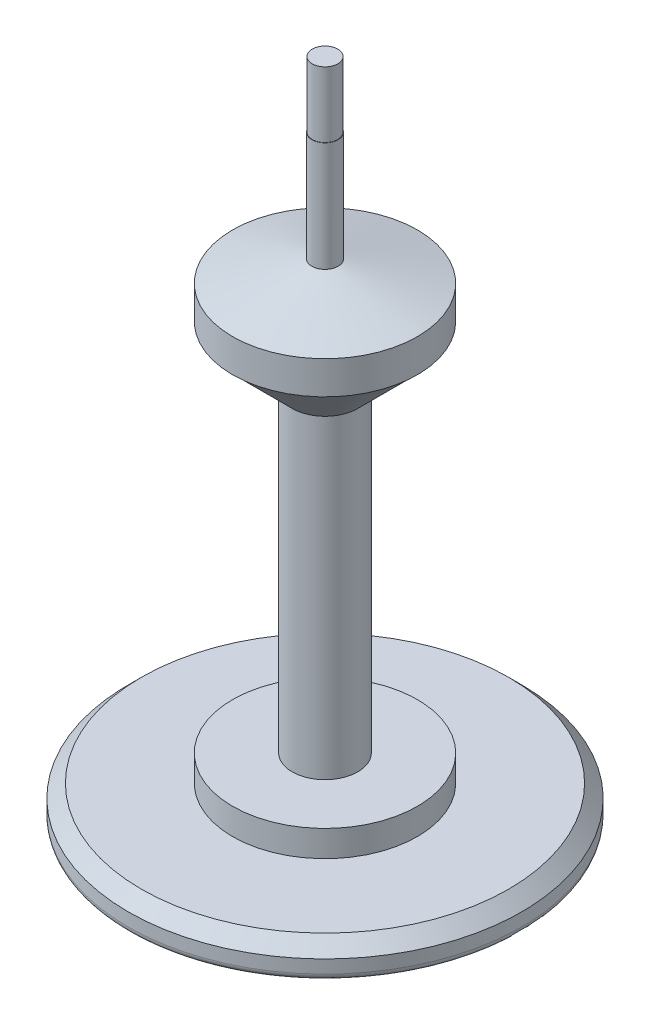
ISO-10303-21;
HEADER;
FILE_DESCRIPTION(('STEP AP214'),'2;1');
FILE_NAME('part.step','',(''),(''),'','','');
FILE_SCHEMA(('AUTOMOTIVE_DESIGN { 1 0 10303 214 1 1 1 1 }'));
ENDSEC;
DATA;
#1=APPLICATION_CONTEXT('core data for automotive mechanical design processes');
#2=APPLICATION_PROTOCOL_DEFINITION('international standard','automotive_design',2000,#1);
#3=PRODUCT_CONTEXT('',#1,'mechanical');
#4=PRODUCT('Part','Part','',(#3));
#5=PRODUCT_RELATED_PRODUCT_CATEGORY('part','',(#4));
#6=PRODUCT_DEFINITION_FORMATION('','',#4);
#7=PRODUCT_DEFINITION_CONTEXT('part definition',#1,'design');
#8=PRODUCT_DEFINITION('design','',#6,#7);
#9=PRODUCT_DEFINITION_SHAPE('','',#8);
#10=(LENGTH_UNIT() NAMED_UNIT(*) SI_UNIT(.MILLI.,.METRE.));
#11=(NAMED_UNIT(*) PLANE_ANGLE_UNIT() SI_UNIT($,.RADIAN.));
#12=(NAMED_UNIT(*) SI_UNIT($,.STERADIAN.) SOLID_ANGLE_UNIT());
#13=UNCERTAINTY_MEASURE_WITH_UNIT(LENGTH_MEASURE(1.E-05),#10,'distance_accuracy_value','');
#14=(GEOMETRIC_REPRESENTATION_CONTEXT(3) GLOBAL_UNCERTAINTY_ASSIGNED_CONTEXT((#13)) GLOBAL_UNIT_ASSIGNED_CONTEXT((#10,
#11,#12)) REPRESENTATION_CONTEXT('',''));
#15=CARTESIAN_POINT('',(0.,0.,0.));
#16=DIRECTION('',(0.,0.,1.));
#17=DIRECTION('',(1.,0.,0.));
#18=AXIS2_PLACEMENT_3D('',#15,#16,#17);
#19=CARTESIAN_POINT('',(0.,79.3548387096774,0.));
#20=DIRECTION('',(0.,1.,0.));
#21=DIRECTION('',(0.,0.,1.));
#22=AXIS2_PLACEMENT_3D('',#19,#20,#21);
#23=CYLINDRICAL_SURFACE('',#22,30.);
#24=CARTESIAN_POINT('',(0.,-52.1048387096774,0.));
#25=DIRECTION('',(0.,-1.,0.));
#26=DIRECTION('',(0.,0.,-1.));
#27=AXIS2_PLACEMENT_3D('',#24,#25,#26);
#28=CIRCLE('',#27,30.);
#29=CARTESIAN_POINT('',(0.,-52.1048387096774,-30.));
#30=VERTEX_POINT('',#29);
#31=EDGE_CURVE('E48',#30,#30,#28,.F.);
#32=ORIENTED_EDGE('',*,*,#31,.T.);
#33=EDGE_LOOP('',(#32));
#34=FACE_BOUND('',#33,.T.);
#35=CARTESIAN_POINT('',(0.,-50.1048387096774,0.));
#36=DIRECTION('',(0.,1.,0.));
#37=DIRECTION('',(0.,0.,1.));
#38=AXIS2_PLACEMENT_3D('',#35,#36,#37);
#39=CIRCLE('',#38,30.);
#40=CARTESIAN_POINT('',(0.,-50.1048387096774,30.));
#41=VERTEX_POINT('',#40);
#42=EDGE_CURVE('E53',#41,#41,#39,.F.);
#43=ORIENTED_EDGE('',*,*,#42,.T.);
#44=EDGE_LOOP('',(#43));
#45=FACE_BOUND('',#44,.T.);
#46=ADVANCED_FACE('F33',(#34,#45),#23,.T.);
#47=CARTESIAN_POINT('',(-30.,-48.1048387096774,0.));
#48=DIRECTION('',(0.,1.,0.));
#49=DIRECTION('',(0.,0.,1.));
#50=AXIS2_PLACEMENT_3D('',#47,#48,#49);
#51=PLANE('',#50);
#52=CARTESIAN_POINT('',(0.,-48.1048387096774,0.));
#53=DIRECTION('',(0.,1.,0.));
#54=DIRECTION('',(0.,0.,1.));
#55=AXIS2_PLACEMENT_3D('',#52,#53,#54);
#56=CIRCLE('',#55,28.);
#57=CARTESIAN_POINT('',(0.,-48.1048387096774,28.));
#58=VERTEX_POINT('',#57);
#59=EDGE_CURVE('E56',#58,#58,#56,.T.);
#60=ORIENTED_EDGE('',*,*,#59,.T.);
#61=EDGE_LOOP('',(#60));
#62=FACE_BOUND('',#61,.T.);
#63=CARTESIAN_POINT('',(0.,-48.1048387096774,0.));
#64=DIRECTION('',(0.,1.,0.));
#65=DIRECTION('',(0.,0.,1.));
#66=AXIS2_PLACEMENT_3D('',#63,#64,#65);
#67=CIRCLE('',#66,14.1);
#68=CARTESIAN_POINT('',(0.,-48.1048387096774,14.1));
#69=VERTEX_POINT('',#68);
#70=EDGE_CURVE('E76',#69,#69,#67,.T.);
#71=ORIENTED_EDGE('',*,*,#70,.F.);
#72=EDGE_LOOP('',(#71));
#73=FACE_BOUND('',#72,.T.);
#74=ADVANCED_FACE('F118',(#62,#73),#51,.T.);
#75=CARTESIAN_POINT('',(0.,79.3548387096774,0.));
#76=DIRECTION('',(0.,1.,0.));
#77=DIRECTION('',(0.,0.,1.));
#78=AXIS2_PLACEMENT_3D('',#75,#76,#77);
#79=CYLINDRICAL_SURFACE('',#78,14.1);
#80=ORIENTED_EDGE('',*,*,#70,.T.);
#81=EDGE_LOOP('',(#80));
#82=FACE_BOUND('',#81,.T.);
#83=CARTESIAN_POINT('',(0.,-44.1048387096774,0.));
#84=DIRECTION('',(0.,1.,0.));
#85=DIRECTION('',(0.,0.,1.));
#86=AXIS2_PLACEMENT_3D('',#83,#84,#85);
#87=CIRCLE('',#86,14.1);
#88=CARTESIAN_POINT('',(0.,-44.1048387096774,14.1));
#89=VERTEX_POINT('',#88);
#90=EDGE_CURVE('E73',#89,#89,#87,.T.);
#91=ORIENTED_EDGE('',*,*,#90,.F.);
#92=EDGE_LOOP('',(#91));
#93=FACE_BOUND('',#92,.T.);
#94=ADVANCED_FACE('F124',(#82,#93),#79,.T.);
#95=CARTESIAN_POINT('',(-14.1,-44.1048387096774,0.));
#96=DIRECTION('',(0.,1.,0.));
#97=DIRECTION('',(0.,0.,1.));
#98=AXIS2_PLACEMENT_3D('',#95,#96,#97);
#99=PLANE('',#98);
#100=ORIENTED_EDGE('',*,*,#90,.T.);
#101=EDGE_LOOP('',(#100));
#102=FACE_BOUND('',#101,.T.);
#103=CARTESIAN_POINT('',(0.,-44.1048387096774,0.));
#104=DIRECTION('',(0.,1.,0.));
#105=DIRECTION('',(0.,0.,1.));
#106=AXIS2_PLACEMENT_3D('',#103,#104,#105);
#107=CIRCLE('',#106,4.99999999999999);
#108=CARTESIAN_POINT('',(0.,-44.1048387096774,4.99999999999999));
#109=VERTEX_POINT('',#108);
#110=EDGE_CURVE('E70',#109,#109,#107,.T.);
#111=ORIENTED_EDGE('',*,*,#110,.F.);
#112=EDGE_LOOP('',(#111));
#113=FACE_BOUND('',#112,.T.);
#114=ADVANCED_FACE('F132',(#102,#113),#99,.T.);
#115=CARTESIAN_POINT('',(0.,79.3548387096774,0.));
#116=DIRECTION('',(0.,1.,0.));
#117=DIRECTION('',(0.,0.,1.));
#118=AXIS2_PLACEMENT_3D('',#115,#116,#117);
#119=CYLINDRICAL_SURFACE('',#118,4.99999999999999);
#120=CARTESIAN_POINT('',(0.,3.89516129032265,0.));
#121=DIRECTION('',(0.,-1.,0.));
#122=DIRECTION('',(0.,0.,-1.));
#123=AXIS2_PLACEMENT_3D('',#120,#121,#122);
#124=CIRCLE('',#123,4.99999999999999);
#125=CARTESIAN_POINT('',(0.,3.89516129032265,-4.99999999999999));
#126=VERTEX_POINT('',#125);
#127=EDGE_CURVE('E10',#126,#126,#124,.T.);
#128=ORIENTED_EDGE('',*,*,#127,.T.);
#129=EDGE_LOOP('',(#128));
#130=FACE_BOUND('',#129,.T.);
#131=ORIENTED_EDGE('',*,*,#110,.T.);
#132=EDGE_LOOP('',(#131));
#133=FACE_BOUND('',#132,.T.);
#134=ADVANCED_FACE('F136',(#130,#133),#119,.T.);
#135=CARTESIAN_POINT('',(-4.99999999999999,12.8951612903226,0.));
#136=DIRECTION('',(0.,-1.,0.));
#137=DIRECTION('',(0.,0.,-1.));
#138=AXIS2_PLACEMENT_3D('',#135,#136,#137);
#139=PLANE('',#138);
#140=CARTESIAN_POINT('',(0.,12.8951612903226,0.));
#141=DIRECTION('',(0.,-1.,0.));
#142=DIRECTION('',(0.,0.,-1.));
#143=AXIS2_PLACEMENT_3D('',#140,#141,#142);
#144=CIRCLE('',#143,14.);
#145=CARTESIAN_POINT('',(0.,12.8951612903226,-14.));
#146=VERTEX_POINT('',#145);
#147=EDGE_CURVE('E40',#146,#146,#144,.F.);
#148=ORIENTED_EDGE('',*,*,#147,.T.);
#149=EDGE_LOOP('',(#148));
#150=FACE_BOUND('',#149,.T.);
#151=CARTESIAN_POINT('',(0.,12.8951612903226,0.));
#152=DIRECTION('',(0.,1.,0.));
#153=DIRECTION('',(0.,0.,1.));
#154=AXIS2_PLACEMENT_3D('',#151,#152,#153);
#155=CIRCLE('',#154,14.1);
#156=CARTESIAN_POINT('',(0.,12.8951612903226,14.1));
#157=VERTEX_POINT('',#156);
#158=EDGE_CURVE('E64',#157,#157,#155,.T.);
#159=ORIENTED_EDGE('',*,*,#158,.F.);
#160=EDGE_LOOP('',(#159));
#161=FACE_BOUND('',#160,.T.);
#162=ADVANCED_FACE('F140',(#150,#161),#139,.T.);
#163=CARTESIAN_POINT('',(0.,79.3548387096774,0.));
#164=DIRECTION('',(0.,1.,0.));
#165=DIRECTION('',(0.,0.,1.));
#166=AXIS2_PLACEMENT_3D('',#163,#164,#165);
#167=CYLINDRICAL_SURFACE('',#166,14.1);
#168=CARTESIAN_POINT('',(0.,17.9353536691873,0.));
#169=DIRECTION('',(0.,-1.,0.));
#170=DIRECTION('',(0.,0.,-1.));
#171=AXIS2_PLACEMENT_3D('',#168,#169,#170);
#172=CIRCLE('',#171,14.1);
#173=CARTESIAN_POINT('',(0.,17.9353536691873,-14.1));
#174=VERTEX_POINT('',#173);
#175=EDGE_CURVE('E63',#174,#174,#172,.F.);
#176=ORIENTED_EDGE('',*,*,#175,.F.);
#177=EDGE_LOOP('',(#176));
#178=FACE_BOUND('',#177,.T.);
#179=ORIENTED_EDGE('',*,*,#158,.T.);
#180=EDGE_LOOP('',(#179));
#181=FACE_BOUND('',#180,.T.);
#182=ADVANCED_FACE('F113',(#178,#181),#167,.T.);
#183=CARTESIAN_POINT('',(-30.,-53.1048387096774,0.));
#184=DIRECTION('',(0.,-1.,0.));
#185=DIRECTION('',(0.,0.,-1.));
#186=AXIS2_PLACEMENT_3D('',#183,#184,#185);
#187=PLANE('',#186);
#188=CARTESIAN_POINT('',(0.,-53.1048387096774,0.));
#189=DIRECTION('',(0.,-1.,0.));
#190=DIRECTION('',(0.,0.,-1.));
#191=AXIS2_PLACEMENT_3D('',#188,#189,#190);
#192=CIRCLE('',#191,29.);
#193=CARTESIAN_POINT('',(0.,-53.1048387096774,-29.));
#194=VERTEX_POINT('',#193);
#195=EDGE_CURVE('E44',#194,#194,#192,.T.);
#196=ORIENTED_EDGE('',*,*,#195,.T.);
#197=EDGE_LOOP('',(#196));
#198=FACE_BOUND('',#197,.T.);
#199=ADVANCED_FACE('F104',(#198),#187,.T.);
#200=CARTESIAN_POINT('',(0.,49.6815158887196,0.));
#201=DIRECTION('',(0.,1.,0.));
#202=DIRECTION('',(0.,0.,1.));
#203=AXIS2_PLACEMENT_3D('',#200,#201,#202);
#204=CYLINDRICAL_SURFACE('',#203,2.);
#205=CARTESIAN_POINT('',(0.,21.1775388976038,0.));
#206=DIRECTION('',(0.,1.,0.));
#207=DIRECTION('',(0.,0.,1.));
#208=AXIS2_PLACEMENT_3D('',#205,#206,#207);
#209=CIRCLE('',#208,2.);
#210=CARTESIAN_POINT('',(0.,21.1775388976038,-1.99999999999996));
#211=VERTEX_POINT('',#210);
#212=EDGE_CURVE('E60',#211,#211,#209,.T.);
#213=ORIENTED_EDGE('',*,*,#212,.T.);
#214=EDGE_LOOP('',(#213));
#215=FACE_BOUND('',#214,.T.);
#216=CARTESIAN_POINT('',(0.,37.8951612903226,0.));
#217=DIRECTION('',(0.,1.,0.));
#218=DIRECTION('',(0.,0.,1.));
#219=AXIS2_PLACEMENT_3D('',#216,#217,#218);
#220=CIRCLE('',#219,1.99999999999998);
#221=CARTESIAN_POINT('',(0.,37.8951612903226,1.99999999999998));
#222=VERTEX_POINT('',#221);
#223=EDGE_CURVE('E65',#222,#222,#220,.T.);
#224=ORIENTED_EDGE('',*,*,#223,.F.);
#225=EDGE_LOOP('',(#224));
#226=FACE_BOUND('',#225,.T.);
#227=ADVANCED_FACE('F102',(#215,#226),#204,.T.);
#228=CARTESIAN_POINT('',(0.,17.8951612903226,0.));
#229=DIRECTION('',(0.,-1.,0.));
#230=DIRECTION('',(0.,0.,-1.));
#231=AXIS2_PLACEMENT_3D('',#228,#229,#230);
#232=CONICAL_SURFACE('',#231,14.25,1.30899693899575);
#233=CARTESIAN_POINT('',(0.,17.9353536691873,-14.1));
#234=CARTESIAN_POINT('',(0.,17.9691264319833,-13.9739583333333));
#235=CARTESIAN_POINT('',(0.,18.0028991947793,-13.8479166666666));
#236=CARTESIAN_POINT('',(0.,18.0704447203713,-13.5958333333333));
#237=CARTESIAN_POINT('',(0.,18.1042174831673,-13.4697916666666));
#238=CARTESIAN_POINT('',(0.,18.1717630087593,-13.2177083333333));
#239=CARTESIAN_POINT('',(0.,18.2055357715553,-13.0916666666666));
#240=CARTESIAN_POINT('',(0.,18.2730812971473,-12.8395833333333));
#241=CARTESIAN_POINT('',(0.,18.3068540599433,-12.7135416666666));
#242=CARTESIAN_POINT('',(0.,18.3743995855353,-12.4614583333333));
#243=CARTESIAN_POINT('',(0.,18.4081723483313,-12.3354166666666));
#244=CARTESIAN_POINT('',(0.,18.4757178739233,-12.0833333333333));
#245=CARTESIAN_POINT('',(0.,18.5094906367194,-11.9572916666666));
#246=CARTESIAN_POINT('',(0.,18.5770361623114,-11.7052083333333));
#247=CARTESIAN_POINT('',(0.,18.6108089251074,-11.5791666666666));
#248=CARTESIAN_POINT('',(0.,18.6783544506994,-11.3270833333333));
#249=CARTESIAN_POINT('',(0.,18.7121272134954,-11.2010416666666));
#250=CARTESIAN_POINT('',(0.,18.7796727390874,-10.9489583333333));
#251=CARTESIAN_POINT('',(0.,18.8134455018834,-10.8229166666666));
#252=CARTESIAN_POINT('',(0.,18.8809910274754,-10.5708333333333));
#253=CARTESIAN_POINT('',(0.,18.9147637902714,-10.4447916666666));
#254=CARTESIAN_POINT('',(0.,18.9823093158634,-10.1927083333333));
#255=CARTESIAN_POINT('',(0.,19.0160820786594,-10.0666666666666));
#256=CARTESIAN_POINT('',(0.,19.0836276042514,-9.81458333333331));
#257=CARTESIAN_POINT('',(0.,19.1174003670475,-9.68854166666664));
#258=CARTESIAN_POINT('',(0.,19.1849458926395,-9.43645833333331));
#259=CARTESIAN_POINT('',(0.,19.2187186554355,-9.31041666666664));
#260=CARTESIAN_POINT('',(0.,19.2862641810275,-9.05833333333331));
#261=CARTESIAN_POINT('',(0.,19.3200369438235,-8.93229166666664));
#262=CARTESIAN_POINT('',(0.,19.3875824694155,-8.68020833333331));
#263=CARTESIAN_POINT('',(0.,19.4213552322115,-8.55416666666664));
#264=CARTESIAN_POINT('',(0.,19.4889007578035,-8.30208333333331));
#265=CARTESIAN_POINT('',(0.,19.5226735205995,-8.17604166666664));
#266=CARTESIAN_POINT('',(0.,19.5902190461915,-7.92395833333331));
#267=CARTESIAN_POINT('',(0.,19.6239918089875,-7.79791666666664));
#268=CARTESIAN_POINT('',(0.,19.6915373345796,-7.5458333333333));
#269=CARTESIAN_POINT('',(0.,19.7253100973756,-7.41979166666664));
#270=CARTESIAN_POINT('',(0.,19.7928556229676,-7.1677083333333));
#271=CARTESIAN_POINT('',(0.,19.8266283857636,-7.04166666666664));
#272=CARTESIAN_POINT('',(0.,19.8941739113556,-6.7895833333333));
#273=CARTESIAN_POINT('',(0.,19.9279466741516,-6.66354166666664));
#274=CARTESIAN_POINT('',(0.,19.9954921997436,-6.4114583333333));
#275=CARTESIAN_POINT('',(0.,20.0292649625396,-6.28541666666664));
#276=CARTESIAN_POINT('',(0.,20.0968104881316,-6.0333333333333));
#277=CARTESIAN_POINT('',(0.,20.1305832509276,-5.90729166666664));
#278=CARTESIAN_POINT('',(0.,20.1981287765196,-5.6552083333333));
#279=CARTESIAN_POINT('',(0.,20.2319015393156,-5.52916666666663));
#280=CARTESIAN_POINT('',(0.,20.2994470649077,-5.2770833333333));
#281=CARTESIAN_POINT('',(0.,20.3332198277037,-5.15104166666663));
#282=CARTESIAN_POINT('',(0.,20.4007653532957,-4.8989583333333));
#283=CARTESIAN_POINT('',(0.,20.4345381160917,-4.77291666666664));
#284=CARTESIAN_POINT('',(0.,20.5020836416837,-4.5208333333333));
#285=CARTESIAN_POINT('',(0.,20.5358564044797,-4.39479166666663));
#286=CARTESIAN_POINT('',(0.,20.6034019300717,-4.1427083333333));
#287=CARTESIAN_POINT('',(0.,20.6371746928677,-4.01666666666663));
#288=CARTESIAN_POINT('',(0.,20.7047202184597,-3.7645833333333));
#289=CARTESIAN_POINT('',(0.,20.7384929812557,-3.63854166666663));
#290=CARTESIAN_POINT('',(0.,20.8060385068477,-3.3864583333333));
#291=CARTESIAN_POINT('',(0.,20.8398112696437,-3.26041666666663));
#292=CARTESIAN_POINT('',(0.,20.9073567952358,-3.0083333333333));
#293=CARTESIAN_POINT('',(0.,20.9411295580318,-2.88229166666663));
#294=CARTESIAN_POINT('',(0.,21.0086750836238,-2.6302083333333));
#295=CARTESIAN_POINT('',(0.,21.0424478464198,-2.50416666666663));
#296=CARTESIAN_POINT('',(0.,21.1099933720118,-2.2520833333333));
#297=CARTESIAN_POINT('',(0.,21.1437661348078,-2.12604166666663));
#298=CARTESIAN_POINT('',(0.,21.1775388976038,-1.99999999999996));
#299=B_SPLINE_CURVE_WITH_KNOTS('',3,(#233,#234,#235,#236,#237,#238,#239,#240,#241,#242,#243,
#244,#245,#246,#247,#248,#249,#250,#251,#252,#253,#254,#255,#256,#257,#258,#259,#260,#261,#262,
#263,#264,#265,#266,#267,#268,#269,#270,#271,#272,#273,#274,#275,#276,#277,#278,#279,#280,#281,
#282,#283,#284,#285,#286,#287,#288,#289,#290,#291,#292,#293,#294,#295,#296,#297,#298),
.UNSPECIFIED.,.F.,.F.,(4,2,2,2,2,2,2,2,2,2,2,2,2,2,2,2,2,2,2,2,2,2,2,2,2,2,2,2,2,2,2,2,4),(0.,
0.391463805717562,0.782927611435124,1.17439141715269,1.56585522287025,1.95731902858781,
2.34878283430537,2.74024664002294,3.1317104457405,3.52317425145806,3.91463805717563,
4.30610186289319,4.69756566861075,5.08902947432832,5.48049328004588,5.87195708576344,
6.26342089148101,6.65488469719857,7.04634850291613,7.4378123086337,7.82927611435126,
8.22073992006882,8.61220372578638,9.00366753150395,9.39513133722151,9.78659514293907,
10.1780589486566,10.5695227543742,10.9609865600918,11.3524503658093,11.7439141715269,
12.1353779772444,12.526841782962),.UNSPECIFIED.);
#300=EDGE_CURVE('BSEAM98',#174,#211,#299,.T.);
#301=ORIENTED_EDGE('',*,*,#175,.T.);
#302=ORIENTED_EDGE('',*,*,#212,.F.);
#303=ORIENTED_EDGE('',*,*,#300,.T.);
#304=ORIENTED_EDGE('',*,*,#300,.F.);
#305=EDGE_LOOP('',(#301,#303,#302,#304));
#306=FACE_BOUND('',#305,.T.);
#307=ADVANCED_FACE('F98',(#306),#232,.T.);
#308=CARTESIAN_POINT('',(-1.99999999999998,37.8951612903226,0.));
#309=DIRECTION('',(0.,1.,0.));
#310=DIRECTION('',(0.,0.,1.));
#311=AXIS2_PLACEMENT_3D('',#308,#309,#310);
#312=PLANE('',#311);
#313=CARTESIAN_POINT('',(0.,37.8951612903226,0.));
#314=DIRECTION('',(0.,1.,0.));
#315=DIRECTION('',(0.,0.,1.));
#316=AXIS2_PLACEMENT_3D('',#313,#314,#315);
#317=CIRCLE('',#316,1.95);
#318=CARTESIAN_POINT('',(0.,37.8951612903226,1.95));
#319=VERTEX_POINT('',#318);
#320=EDGE_CURVE('E59',#319,#319,#317,.T.);
#321=ORIENTED_EDGE('',*,*,#320,.F.);
#322=EDGE_LOOP('',(#321));
#323=FACE_BOUND('',#322,.T.);
#324=ORIENTED_EDGE('',*,*,#223,.T.);
#325=EDGE_LOOP('',(#324));
#326=FACE_BOUND('',#325,.T.);
#327=ADVANCED_FACE('F92',(#323,#326),#312,.T.);
#328=CARTESIAN_POINT('',(0.,47.8951612903226,0.));
#329=DIRECTION('',(0.,-1.,0.));
#330=DIRECTION('',(0.,0.,-1.));
#331=AXIS2_PLACEMENT_3D('',#328,#329,#330);
#332=CYLINDRICAL_SURFACE('',#331,1.95);
#333=CARTESIAN_POINT('',(0.,47.8951612903226,0.));
#334=DIRECTION('',(0.,1.,0.));
#335=DIRECTION('',(0.,0.,1.));
#336=AXIS2_PLACEMENT_3D('',#333,#334,#335);
#337=CIRCLE('',#336,1.95);
#338=CARTESIAN_POINT('',(0.,47.8951612903226,1.95));
#339=VERTEX_POINT('',#338);
#340=EDGE_CURVE('E79',#339,#339,#337,.T.);
#341=ORIENTED_EDGE('',*,*,#340,.F.);
#342=EDGE_LOOP('',(#341));
#343=FACE_BOUND('',#342,.T.);
#344=ORIENTED_EDGE('',*,*,#320,.T.);
#345=EDGE_LOOP('',(#344));
#346=FACE_BOUND('',#345,.T.);
#347=ADVANCED_FACE('F89',(#343,#346),#332,.T.);
#348=CARTESIAN_POINT('',(0.,47.8951612903226,0.));
#349=DIRECTION('',(0.,1.,0.));
#350=DIRECTION('',(0.,0.,1.));
#351=AXIS2_PLACEMENT_3D('',#348,#349,#350);
#352=PLANE('',#351);
#353=ORIENTED_EDGE('',*,*,#340,.T.);
#354=EDGE_LOOP('',(#353));
#355=FACE_BOUND('',#354,.T.);
#356=ADVANCED_FACE('F87',(#355),#352,.T.);
#357=CARTESIAN_POINT('',(0.,-48.1048387096774,0.));
#358=DIRECTION('',(0.,-1.,0.));
#359=DIRECTION('',(0.,0.,-1.));
#360=AXIS2_PLACEMENT_3D('',#357,#358,#359);
#361=CONICAL_SURFACE('',#360,28.,0.785398163397452);
#362=ORIENTED_EDGE('',*,*,#42,.F.);
#363=EDGE_LOOP('',(#362));
#364=FACE_BOUND('',#363,.T.);
#365=ORIENTED_EDGE('',*,*,#59,.F.);
#366=EDGE_LOOP('',(#365));
#367=FACE_BOUND('',#366,.T.);
#368=ADVANCED_FACE('F153',(#364,#367),#361,.T.);
#369=CARTESIAN_POINT('',(0.,-52.1048387096774,0.));
#370=DIRECTION('',(0.,-1.,0.));
#371=DIRECTION('',(0.,0.,-1.));
#372=AXIS2_PLACEMENT_3D('',#369,#370,#371);
#373=TOROIDAL_SURFACE('',#372,29.,1.);
#374=ORIENTED_EDGE('',*,*,#195,.F.);
#375=EDGE_LOOP('',(#374));
#376=FACE_BOUND('',#375,.T.);
#377=ORIENTED_EDGE('',*,*,#31,.F.);
#378=EDGE_LOOP('',(#377));
#379=FACE_BOUND('',#378,.T.);
#380=ADVANCED_FACE('F155',(#376,#379),#373,.T.);
#381=CARTESIAN_POINT('',(0.,12.8951612903226,0.));
#382=DIRECTION('',(0.,1.,0.));
#383=DIRECTION('',(0.,0.,1.));
#384=AXIS2_PLACEMENT_3D('',#381,#382,#383);
#385=CONICAL_SURFACE('',#384,14.,0.785398163397454);
#386=ORIENTED_EDGE('',*,*,#127,.F.);
#387=EDGE_LOOP('',(#386));
#388=FACE_BOUND('',#387,.T.);
#389=ORIENTED_EDGE('',*,*,#147,.F.);
#390=EDGE_LOOP('',(#389));
#391=FACE_BOUND('',#390,.T.);
#392=ADVANCED_FACE('F35',(#388,#391),#385,.T.);
#393=CLOSED_SHELL('',(#46,#74,#94,#114,#134,#162,#182,#199,#227,#307,#327,#347,#356,#368,#380,#392));
#394=MANIFOLD_SOLID_BREP('B2',#393);
#395=ADVANCED_BREP_SHAPE_REPRESENTATION('',(#18,#394),#14);
#396=SHAPE_DEFINITION_REPRESENTATION(#9,#395);
ENDSEC;
END-ISO-10303-21;
